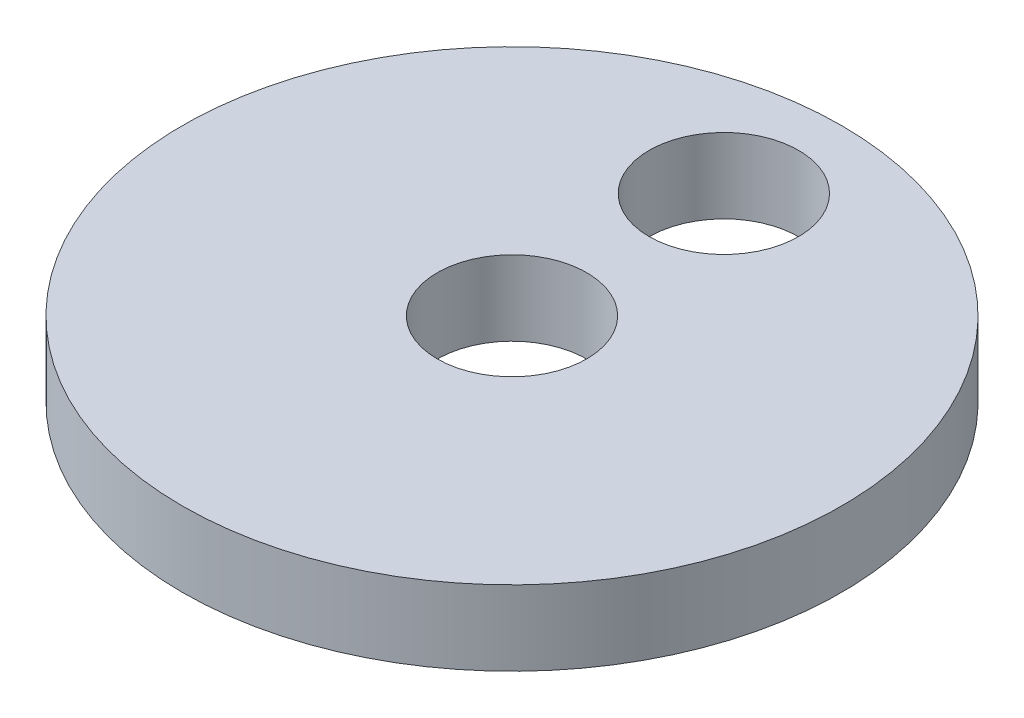
ISO-10303-21;
HEADER;
FILE_DESCRIPTION(('STEP AP214'),'2;1');
FILE_NAME('part.step','',(''),(''),'','','');
FILE_SCHEMA(('AUTOMOTIVE_DESIGN { 1 0 10303 214 1 1 1 1 }'));
ENDSEC;
DATA;
#1=APPLICATION_CONTEXT('core data for automotive mechanical design processes');
#2=APPLICATION_PROTOCOL_DEFINITION('international standard','automotive_design',2000,#1);
#3=PRODUCT_CONTEXT('',#1,'mechanical');
#4=PRODUCT('Part','Part','',(#3));
#5=PRODUCT_RELATED_PRODUCT_CATEGORY('part','',(#4));
#6=PRODUCT_DEFINITION_FORMATION('','',#4);
#7=PRODUCT_DEFINITION_CONTEXT('part definition',#1,'design');
#8=PRODUCT_DEFINITION('design','',#6,#7);
#9=PRODUCT_DEFINITION_SHAPE('','',#8);
#10=(LENGTH_UNIT() NAMED_UNIT(*) SI_UNIT(.MILLI.,.METRE.));
#11=(NAMED_UNIT(*) PLANE_ANGLE_UNIT() SI_UNIT($,.RADIAN.));
#12=(NAMED_UNIT(*) SI_UNIT($,.STERADIAN.) SOLID_ANGLE_UNIT());
#13=UNCERTAINTY_MEASURE_WITH_UNIT(LENGTH_MEASURE(1.E-05),#10,'distance_accuracy_value','');
#14=(GEOMETRIC_REPRESENTATION_CONTEXT(3) GLOBAL_UNCERTAINTY_ASSIGNED_CONTEXT((#13)) GLOBAL_UNIT_ASSIGNED_CONTEXT((#10,
#11,#12)) REPRESENTATION_CONTEXT('',''));
#15=CARTESIAN_POINT('',(0.,0.,0.));
#16=DIRECTION('',(0.,0.,1.));
#17=DIRECTION('',(1.,0.,0.));
#18=AXIS2_PLACEMENT_3D('',#15,#16,#17);
#19=CARTESIAN_POINT('',(0.,3.18,0.));
#20=DIRECTION('',(0.,-1.,0.));
#21=DIRECTION('',(0.,0.,-1.));
#22=AXIS2_PLACEMENT_3D('',#19,#20,#21);
#23=CYLINDRICAL_SURFACE('',#22,14.);
#24=CARTESIAN_POINT('',(0.,3.18,0.));
#25=DIRECTION('',(0.,1.,0.));
#26=DIRECTION('',(0.,0.,1.));
#27=AXIS2_PLACEMENT_3D('',#24,#25,#26);
#28=CIRCLE('',#27,14.);
#29=CARTESIAN_POINT('',(0.,3.18,-14.));
#30=VERTEX_POINT('',#29);
#31=EDGE_CURVE('E10',#30,#30,#28,.T.);
#32=CARTESIAN_POINT('',(0.,0.,0.));
#33=DIRECTION('',(0.,1.,0.));
#34=DIRECTION('',(0.,0.,1.));
#35=AXIS2_PLACEMENT_3D('',#32,#33,#34);
#36=CIRCLE('',#35,14.);
#37=CARTESIAN_POINT('',(0.,0.,-14.));
#38=VERTEX_POINT('',#37);
#39=EDGE_CURVE('E33',#38,#38,#36,.T.);
#40=CARTESIAN_POINT('',(0.,3.18,-14.));
#41=CARTESIAN_POINT('',(0.,3.146875,-14.));
#42=CARTESIAN_POINT('',(0.,3.11375,-14.));
#43=CARTESIAN_POINT('',(0.,3.0475,-14.));
#44=CARTESIAN_POINT('',(0.,3.014375,-14.));
#45=CARTESIAN_POINT('',(0.,2.948125,-14.));
#46=CARTESIAN_POINT('',(0.,2.915,-14.));
#47=CARTESIAN_POINT('',(0.,2.84875,-14.));
#48=CARTESIAN_POINT('',(0.,2.815625,-14.));
#49=CARTESIAN_POINT('',(0.,2.749375,-14.));
#50=CARTESIAN_POINT('',(0.,2.71625,-14.));
#51=CARTESIAN_POINT('',(0.,2.65,-14.));
#52=CARTESIAN_POINT('',(0.,2.616875,-14.));
#53=CARTESIAN_POINT('',(0.,2.550625,-14.));
#54=CARTESIAN_POINT('',(0.,2.5175,-14.));
#55=CARTESIAN_POINT('',(0.,2.45125,-14.));
#56=CARTESIAN_POINT('',(0.,2.418125,-14.));
#57=CARTESIAN_POINT('',(0.,2.351875,-14.));
#58=CARTESIAN_POINT('',(0.,2.31875,-14.));
#59=CARTESIAN_POINT('',(0.,2.2525,-14.));
#60=CARTESIAN_POINT('',(0.,2.219375,-14.));
#61=CARTESIAN_POINT('',(0.,2.153125,-14.));
#62=CARTESIAN_POINT('',(0.,2.12,-14.));
#63=CARTESIAN_POINT('',(0.,2.05375,-14.));
#64=CARTESIAN_POINT('',(0.,2.020625,-14.));
#65=CARTESIAN_POINT('',(0.,1.954375,-14.));
#66=CARTESIAN_POINT('',(0.,1.92125,-14.));
#67=CARTESIAN_POINT('',(0.,1.855,-14.));
#68=CARTESIAN_POINT('',(0.,1.821875,-14.));
#69=CARTESIAN_POINT('',(0.,1.755625,-14.));
#70=CARTESIAN_POINT('',(0.,1.7225,-14.));
#71=CARTESIAN_POINT('',(0.,1.65625,-14.));
#72=CARTESIAN_POINT('',(0.,1.623125,-14.));
#73=CARTESIAN_POINT('',(0.,1.556875,-14.));
#74=CARTESIAN_POINT('',(0.,1.52375,-14.));
#75=CARTESIAN_POINT('',(0.,1.4575,-14.));
#76=CARTESIAN_POINT('',(0.,1.424375,-14.));
#77=CARTESIAN_POINT('',(0.,1.358125,-14.));
#78=CARTESIAN_POINT('',(0.,1.325,-14.));
#79=CARTESIAN_POINT('',(0.,1.25875,-14.));
#80=CARTESIAN_POINT('',(0.,1.225625,-14.));
#81=CARTESIAN_POINT('',(0.,1.159375,-14.));
#82=CARTESIAN_POINT('',(0.,1.12625,-14.));
#83=CARTESIAN_POINT('',(0.,1.06,-14.));
#84=CARTESIAN_POINT('',(0.,1.026875,-14.));
#85=CARTESIAN_POINT('',(0.,0.960625,-14.));
#86=CARTESIAN_POINT('',(0.,0.9275,-14.));
#87=CARTESIAN_POINT('',(0.,0.86125,-14.));
#88=CARTESIAN_POINT('',(0.,0.828125,-14.));
#89=CARTESIAN_POINT('',(0.,0.761875,-14.));
#90=CARTESIAN_POINT('',(0.,0.72875,-14.));
#91=CARTESIAN_POINT('',(0.,0.6625,-14.));
#92=CARTESIAN_POINT('',(0.,0.629375,-14.));
#93=CARTESIAN_POINT('',(0.,0.563125,-14.));
#94=CARTESIAN_POINT('',(0.,0.53,-14.));
#95=CARTESIAN_POINT('',(0.,0.46375,-14.));
#96=CARTESIAN_POINT('',(0.,0.430625,-14.));
#97=CARTESIAN_POINT('',(0.,0.364375,-14.));
#98=CARTESIAN_POINT('',(0.,0.33125,-14.));
#99=CARTESIAN_POINT('',(0.,0.265,-14.));
#100=CARTESIAN_POINT('',(0.,0.231875,-14.));
#101=CARTESIAN_POINT('',(0.,0.165625,-14.));
#102=CARTESIAN_POINT('',(0.,0.1325,-14.));
#103=CARTESIAN_POINT('',(0.,0.06625,-14.));
#104=CARTESIAN_POINT('',(0.,0.033125,-14.));
#105=CARTESIAN_POINT('',(0.,0.,-14.));
#106=B_SPLINE_CURVE_WITH_KNOTS('',3,(#40,#41,#42,#43,#44,#45,#46,#47,#48,#49,#50,#51,#52,#53,
#54,#55,#56,#57,#58,#59,#60,#61,#62,#63,#64,#65,#66,#67,#68,#69,#70,#71,#72,#73,#74,#75,#76,#77,
#78,#79,#80,#81,#82,#83,#84,#85,#86,#87,#88,#89,#90,#91,#92,#93,#94,#95,#96,#97,#98,#99,#100,
#101,#102,#103,#104,#105),.UNSPECIFIED.,.F.,.F.,(4,2,2,2,2,2,2,2,2,2,2,2,2,2,2,2,2,2,2,2,2,2,2,
2,2,2,2,2,2,2,2,2,4),(0.,0.0993750000000001,0.19875,0.298125,0.3975,0.496875,0.59625,0.695625,
0.795,0.894375,0.99375,1.093125,1.1925,1.291875,1.39125,1.490625,1.59,1.689375,1.78875,1.888125,
1.9875,2.086875,2.18625,2.285625,2.385,2.484375,2.58375,2.683125,2.7825,2.881875,2.98125,
3.080625,3.18),.UNSPECIFIED.);
#107=EDGE_CURVE('BSEAM30',#30,#38,#106,.T.);
#108=ORIENTED_EDGE('',*,*,#31,.F.);
#109=ORIENTED_EDGE('',*,*,#39,.T.);
#110=ORIENTED_EDGE('',*,*,#107,.T.);
#111=ORIENTED_EDGE('',*,*,#107,.F.);
#112=EDGE_LOOP('',(#108,#110,#109,#111));
#113=FACE_BOUND('',#112,.T.);
#114=ADVANCED_FACE('F30',(#113),#23,.T.);
#115=CARTESIAN_POINT('',(0.,3.18,0.));
#116=DIRECTION('',(0.,1.,0.));
#117=DIRECTION('',(0.,0.,1.));
#118=AXIS2_PLACEMENT_3D('',#115,#116,#117);
#119=PLANE('',#118);
#120=CARTESIAN_POINT('',(0.,3.18,-9.));
#121=DIRECTION('',(0.,1.,0.));
#122=DIRECTION('',(0.,0.,1.));
#123=AXIS2_PLACEMENT_3D('',#120,#121,#122);
#124=CIRCLE('',#123,3.175);
#125=CARTESIAN_POINT('',(0.,3.18,-5.825));
#126=VERTEX_POINT('',#125);
#127=EDGE_CURVE('E48',#126,#126,#124,.T.);
#128=ORIENTED_EDGE('',*,*,#127,.F.);
#129=EDGE_LOOP('',(#128));
#130=FACE_BOUND('',#129,.T.);
#131=CARTESIAN_POINT('',(0.,3.18,0.));
#132=DIRECTION('',(0.,1.,0.));
#133=DIRECTION('',(0.,0.,1.));
#134=AXIS2_PLACEMENT_3D('',#131,#132,#133);
#135=CIRCLE('',#134,3.175);
#136=CARTESIAN_POINT('',(0.,3.18,3.175));
#137=VERTEX_POINT('',#136);
#138=EDGE_CURVE('E42',#137,#137,#135,.T.);
#139=ORIENTED_EDGE('',*,*,#138,.F.);
#140=EDGE_LOOP('',(#139));
#141=FACE_BOUND('',#140,.T.);
#142=ORIENTED_EDGE('',*,*,#31,.T.);
#143=EDGE_LOOP('',(#142));
#144=FACE_BOUND('',#143,.T.);
#145=ADVANCED_FACE('F64',(#130,#141,#144),#119,.T.);
#146=CARTESIAN_POINT('',(0.,0.,0.));
#147=DIRECTION('',(0.,1.,0.));
#148=DIRECTION('',(0.,0.,1.));
#149=AXIS2_PLACEMENT_3D('',#146,#147,#148);
#150=PLANE('',#149);
#151=CARTESIAN_POINT('',(0.,0.,-9.));
#152=DIRECTION('',(0.,1.,0.));
#153=DIRECTION('',(0.,0.,1.));
#154=AXIS2_PLACEMENT_3D('',#151,#152,#153);
#155=CIRCLE('',#154,3.175);
#156=CARTESIAN_POINT('',(0.,0.,-5.825));
#157=VERTEX_POINT('',#156);
#158=EDGE_CURVE('E45',#157,#157,#155,.T.);
#159=ORIENTED_EDGE('',*,*,#158,.T.);
#160=EDGE_LOOP('',(#159));
#161=FACE_BOUND('',#160,.T.);
#162=CARTESIAN_POINT('',(0.,0.,0.));
#163=DIRECTION('',(0.,1.,0.));
#164=DIRECTION('',(0.,0.,1.));
#165=AXIS2_PLACEMENT_3D('',#162,#163,#164);
#166=CIRCLE('',#165,3.175);
#167=CARTESIAN_POINT('',(0.,0.,3.175));
#168=VERTEX_POINT('',#167);
#169=EDGE_CURVE('E40',#168,#168,#166,.T.);
#170=ORIENTED_EDGE('',*,*,#169,.T.);
#171=EDGE_LOOP('',(#170));
#172=FACE_BOUND('',#171,.T.);
#173=ORIENTED_EDGE('',*,*,#39,.F.);
#174=EDGE_LOOP('',(#173));
#175=FACE_BOUND('',#174,.T.);
#176=ADVANCED_FACE('F54',(#161,#172,#175),#150,.F.);
#177=CARTESIAN_POINT('',(0.,0.,0.));
#178=DIRECTION('',(0.,1.,0.));
#179=DIRECTION('',(0.,0.,1.));
#180=AXIS2_PLACEMENT_3D('',#177,#178,#179);
#181=CYLINDRICAL_SURFACE('',#180,3.175);
#182=CARTESIAN_POINT('',(0.,0.,3.175));
#183=CARTESIAN_POINT('',(0.,0.033125,3.175));
#184=CARTESIAN_POINT('',(0.,0.06625,3.175));
#185=CARTESIAN_POINT('',(0.,0.1325,3.175));
#186=CARTESIAN_POINT('',(0.,0.165625,3.175));
#187=CARTESIAN_POINT('',(0.,0.231875,3.175));
#188=CARTESIAN_POINT('',(0.,0.265,3.175));
#189=CARTESIAN_POINT('',(0.,0.33125,3.175));
#190=CARTESIAN_POINT('',(0.,0.364375,3.175));
#191=CARTESIAN_POINT('',(0.,0.430625,3.175));
#192=CARTESIAN_POINT('',(0.,0.46375,3.175));
#193=CARTESIAN_POINT('',(0.,0.53,3.175));
#194=CARTESIAN_POINT('',(0.,0.563125,3.175));
#195=CARTESIAN_POINT('',(0.,0.629375,3.175));
#196=CARTESIAN_POINT('',(0.,0.6625,3.175));
#197=CARTESIAN_POINT('',(0.,0.72875,3.175));
#198=CARTESIAN_POINT('',(0.,0.761875,3.175));
#199=CARTESIAN_POINT('',(0.,0.828125,3.175));
#200=CARTESIAN_POINT('',(0.,0.86125,3.175));
#201=CARTESIAN_POINT('',(0.,0.9275,3.175));
#202=CARTESIAN_POINT('',(0.,0.960625,3.175));
#203=CARTESIAN_POINT('',(0.,1.026875,3.175));
#204=CARTESIAN_POINT('',(0.,1.06,3.175));
#205=CARTESIAN_POINT('',(0.,1.12625,3.175));
#206=CARTESIAN_POINT('',(0.,1.159375,3.175));
#207=CARTESIAN_POINT('',(0.,1.225625,3.175));
#208=CARTESIAN_POINT('',(0.,1.25875,3.175));
#209=CARTESIAN_POINT('',(0.,1.325,3.175));
#210=CARTESIAN_POINT('',(0.,1.358125,3.175));
#211=CARTESIAN_POINT('',(0.,1.424375,3.175));
#212=CARTESIAN_POINT('',(0.,1.4575,3.175));
#213=CARTESIAN_POINT('',(0.,1.52375,3.175));
#214=CARTESIAN_POINT('',(0.,1.556875,3.175));
#215=CARTESIAN_POINT('',(0.,1.623125,3.175));
#216=CARTESIAN_POINT('',(0.,1.65625,3.175));
#217=CARTESIAN_POINT('',(0.,1.7225,3.175));
#218=CARTESIAN_POINT('',(0.,1.755625,3.175));
#219=CARTESIAN_POINT('',(0.,1.821875,3.175));
#220=CARTESIAN_POINT('',(0.,1.855,3.175));
#221=CARTESIAN_POINT('',(0.,1.92125,3.175));
#222=CARTESIAN_POINT('',(0.,1.954375,3.175));
#223=CARTESIAN_POINT('',(0.,2.020625,3.175));
#224=CARTESIAN_POINT('',(0.,2.05375,3.175));
#225=CARTESIAN_POINT('',(0.,2.12,3.175));
#226=CARTESIAN_POINT('',(0.,2.153125,3.175));
#227=CARTESIAN_POINT('',(0.,2.219375,3.175));
#228=CARTESIAN_POINT('',(0.,2.2525,3.175));
#229=CARTESIAN_POINT('',(0.,2.31875,3.175));
#230=CARTESIAN_POINT('',(0.,2.351875,3.175));
#231=CARTESIAN_POINT('',(0.,2.418125,3.175));
#232=CARTESIAN_POINT('',(0.,2.45125,3.175));
#233=CARTESIAN_POINT('',(0.,2.5175,3.175));
#234=CARTESIAN_POINT('',(0.,2.550625,3.175));
#235=CARTESIAN_POINT('',(0.,2.616875,3.175));
#236=CARTESIAN_POINT('',(0.,2.65,3.175));
#237=CARTESIAN_POINT('',(0.,2.71625,3.175));
#238=CARTESIAN_POINT('',(0.,2.749375,3.175));
#239=CARTESIAN_POINT('',(0.,2.815625,3.175));
#240=CARTESIAN_POINT('',(0.,2.84875,3.175));
#241=CARTESIAN_POINT('',(0.,2.915,3.175));
#242=CARTESIAN_POINT('',(0.,2.948125,3.175));
#243=CARTESIAN_POINT('',(0.,3.014375,3.175));
#244=CARTESIAN_POINT('',(0.,3.0475,3.175));
#245=CARTESIAN_POINT('',(0.,3.11375,3.175));
#246=CARTESIAN_POINT('',(0.,3.146875,3.175));
#247=CARTESIAN_POINT('',(0.,3.18,3.175));
#248=B_SPLINE_CURVE_WITH_KNOTS('',3,(#182,#183,#184,#185,#186,#187,#188,#189,#190,#191,#192,
#193,#194,#195,#196,#197,#198,#199,#200,#201,#202,#203,#204,#205,#206,#207,#208,#209,#210,#211,
#212,#213,#214,#215,#216,#217,#218,#219,#220,#221,#222,#223,#224,#225,#226,#227,#228,#229,#230,
#231,#232,#233,#234,#235,#236,#237,#238,#239,#240,#241,#242,#243,#244,#245,#246,#247),
.UNSPECIFIED.,.F.,.F.,(4,2,2,2,2,2,2,2,2,2,2,2,2,2,2,2,2,2,2,2,2,2,2,2,2,2,2,2,2,2,2,2,4),(0.,
0.099375,0.19875,0.298125,0.3975,0.496875,0.59625,0.695625,0.795,0.894375,0.99375,1.093125,
1.1925,1.291875,1.39125,1.490625,1.59,1.689375,1.78875,1.888125,1.9875,2.086875,2.18625,
2.285625,2.385,2.484375,2.58375,2.683125,2.7825,2.881875,2.98125,3.080625,3.18),.UNSPECIFIED.);
#249=EDGE_CURVE('BSEAM60',#168,#137,#248,.T.);
#250=ORIENTED_EDGE('',*,*,#169,.F.);
#251=ORIENTED_EDGE('',*,*,#138,.T.);
#252=ORIENTED_EDGE('',*,*,#249,.T.);
#253=ORIENTED_EDGE('',*,*,#249,.F.);
#254=EDGE_LOOP('',(#250,#252,#251,#253));
#255=FACE_BOUND('',#254,.T.);
#256=ADVANCED_FACE('F60',(#255),#181,.F.);
#257=CARTESIAN_POINT('',(0.,0.,-9.));
#258=DIRECTION('',(0.,1.,0.));
#259=DIRECTION('',(0.,0.,1.));
#260=AXIS2_PLACEMENT_3D('',#257,#258,#259);
#261=CYLINDRICAL_SURFACE('',#260,3.175);
#262=CARTESIAN_POINT('',(0.,0.,-5.825));
#263=CARTESIAN_POINT('',(0.,0.033125,-5.825));
#264=CARTESIAN_POINT('',(0.,0.06625,-5.825));
#265=CARTESIAN_POINT('',(0.,0.1325,-5.825));
#266=CARTESIAN_POINT('',(0.,0.165625,-5.825));
#267=CARTESIAN_POINT('',(0.,0.231875,-5.825));
#268=CARTESIAN_POINT('',(0.,0.265,-5.825));
#269=CARTESIAN_POINT('',(0.,0.33125,-5.825));
#270=CARTESIAN_POINT('',(0.,0.364375,-5.825));
#271=CARTESIAN_POINT('',(0.,0.430625,-5.825));
#272=CARTESIAN_POINT('',(0.,0.46375,-5.825));
#273=CARTESIAN_POINT('',(0.,0.53,-5.825));
#274=CARTESIAN_POINT('',(0.,0.563125,-5.825));
#275=CARTESIAN_POINT('',(0.,0.629375,-5.825));
#276=CARTESIAN_POINT('',(0.,0.6625,-5.825));
#277=CARTESIAN_POINT('',(0.,0.72875,-5.825));
#278=CARTESIAN_POINT('',(0.,0.761875,-5.825));
#279=CARTESIAN_POINT('',(0.,0.828125,-5.825));
#280=CARTESIAN_POINT('',(0.,0.86125,-5.825));
#281=CARTESIAN_POINT('',(0.,0.9275,-5.825));
#282=CARTESIAN_POINT('',(0.,0.960625,-5.825));
#283=CARTESIAN_POINT('',(0.,1.026875,-5.825));
#284=CARTESIAN_POINT('',(0.,1.06,-5.825));
#285=CARTESIAN_POINT('',(0.,1.12625,-5.825));
#286=CARTESIAN_POINT('',(0.,1.159375,-5.825));
#287=CARTESIAN_POINT('',(0.,1.225625,-5.825));
#288=CARTESIAN_POINT('',(0.,1.25875,-5.825));
#289=CARTESIAN_POINT('',(0.,1.325,-5.825));
#290=CARTESIAN_POINT('',(0.,1.358125,-5.825));
#291=CARTESIAN_POINT('',(0.,1.424375,-5.825));
#292=CARTESIAN_POINT('',(0.,1.4575,-5.825));
#293=CARTESIAN_POINT('',(0.,1.52375,-5.825));
#294=CARTESIAN_POINT('',(0.,1.556875,-5.825));
#295=CARTESIAN_POINT('',(0.,1.623125,-5.825));
#296=CARTESIAN_POINT('',(0.,1.65625,-5.825));
#297=CARTESIAN_POINT('',(0.,1.7225,-5.825));
#298=CARTESIAN_POINT('',(0.,1.755625,-5.825));
#299=CARTESIAN_POINT('',(0.,1.821875,-5.825));
#300=CARTESIAN_POINT('',(0.,1.855,-5.825));
#301=CARTESIAN_POINT('',(0.,1.92125,-5.825));
#302=CARTESIAN_POINT('',(0.,1.954375,-5.825));
#303=CARTESIAN_POINT('',(0.,2.020625,-5.825));
#304=CARTESIAN_POINT('',(0.,2.05375,-5.825));
#305=CARTESIAN_POINT('',(0.,2.12,-5.825));
#306=CARTESIAN_POINT('',(0.,2.153125,-5.825));
#307=CARTESIAN_POINT('',(0.,2.219375,-5.825));
#308=CARTESIAN_POINT('',(0.,2.2525,-5.825));
#309=CARTESIAN_POINT('',(0.,2.31875,-5.825));
#310=CARTESIAN_POINT('',(0.,2.351875,-5.825));
#311=CARTESIAN_POINT('',(0.,2.418125,-5.825));
#312=CARTESIAN_POINT('',(0.,2.45125,-5.825));
#313=CARTESIAN_POINT('',(0.,2.5175,-5.825));
#314=CARTESIAN_POINT('',(0.,2.550625,-5.825));
#315=CARTESIAN_POINT('',(0.,2.616875,-5.825));
#316=CARTESIAN_POINT('',(0.,2.65,-5.825));
#317=CARTESIAN_POINT('',(0.,2.71625,-5.825));
#318=CARTESIAN_POINT('',(0.,2.749375,-5.825));
#319=CARTESIAN_POINT('',(0.,2.815625,-5.825));
#320=CARTESIAN_POINT('',(0.,2.84875,-5.825));
#321=CARTESIAN_POINT('',(0.,2.915,-5.825));
#322=CARTESIAN_POINT('',(0.,2.948125,-5.825));
#323=CARTESIAN_POINT('',(0.,3.014375,-5.825));
#324=CARTESIAN_POINT('',(0.,3.0475,-5.825));
#325=CARTESIAN_POINT('',(0.,3.11375,-5.825));
#326=CARTESIAN_POINT('',(0.,3.146875,-5.825));
#327=CARTESIAN_POINT('',(0.,3.18,-5.825));
#328=B_SPLINE_CURVE_WITH_KNOTS('',3,(#262,#263,#264,#265,#266,#267,#268,#269,#270,#271,#272,
#273,#274,#275,#276,#277,#278,#279,#280,#281,#282,#283,#284,#285,#286,#287,#288,#289,#290,#291,
#292,#293,#294,#295,#296,#297,#298,#299,#300,#301,#302,#303,#304,#305,#306,#307,#308,#309,#310,
#311,#312,#313,#314,#315,#316,#317,#318,#319,#320,#321,#322,#323,#324,#325,#326,#327),
.UNSPECIFIED.,.F.,.F.,(4,2,2,2,2,2,2,2,2,2,2,2,2,2,2,2,2,2,2,2,2,2,2,2,2,2,2,2,2,2,2,2,4),(0.,
0.099375,0.19875,0.298125,0.3975,0.496875,0.59625,0.695625,0.795,0.894375,0.99375,1.093125,
1.1925,1.291875,1.39125,1.490625,1.59,1.689375,1.78875,1.888125,1.9875,2.086875,2.18625,
2.285625,2.385,2.484375,2.58375,2.683125,2.7825,2.881875,2.98125,3.080625,3.18),.UNSPECIFIED.);
#329=EDGE_CURVE('BSEAM57',#157,#126,#328,.T.);
#330=ORIENTED_EDGE('',*,*,#158,.F.);
#331=ORIENTED_EDGE('',*,*,#127,.T.);
#332=ORIENTED_EDGE('',*,*,#329,.T.);
#333=ORIENTED_EDGE('',*,*,#329,.F.);
#334=EDGE_LOOP('',(#330,#332,#331,#333));
#335=FACE_BOUND('',#334,.T.);
#336=ADVANCED_FACE('F57',(#335),#261,.F.);
#337=CLOSED_SHELL('',(#114,#145,#176,#256,#336));
#338=MANIFOLD_SOLID_BREP('B2',#337);
#339=ADVANCED_BREP_SHAPE_REPRESENTATION('',(#18,#338),#14);
#340=SHAPE_DEFINITION_REPRESENTATION(#9,#339);
ENDSEC;
END-ISO-10303-21;
